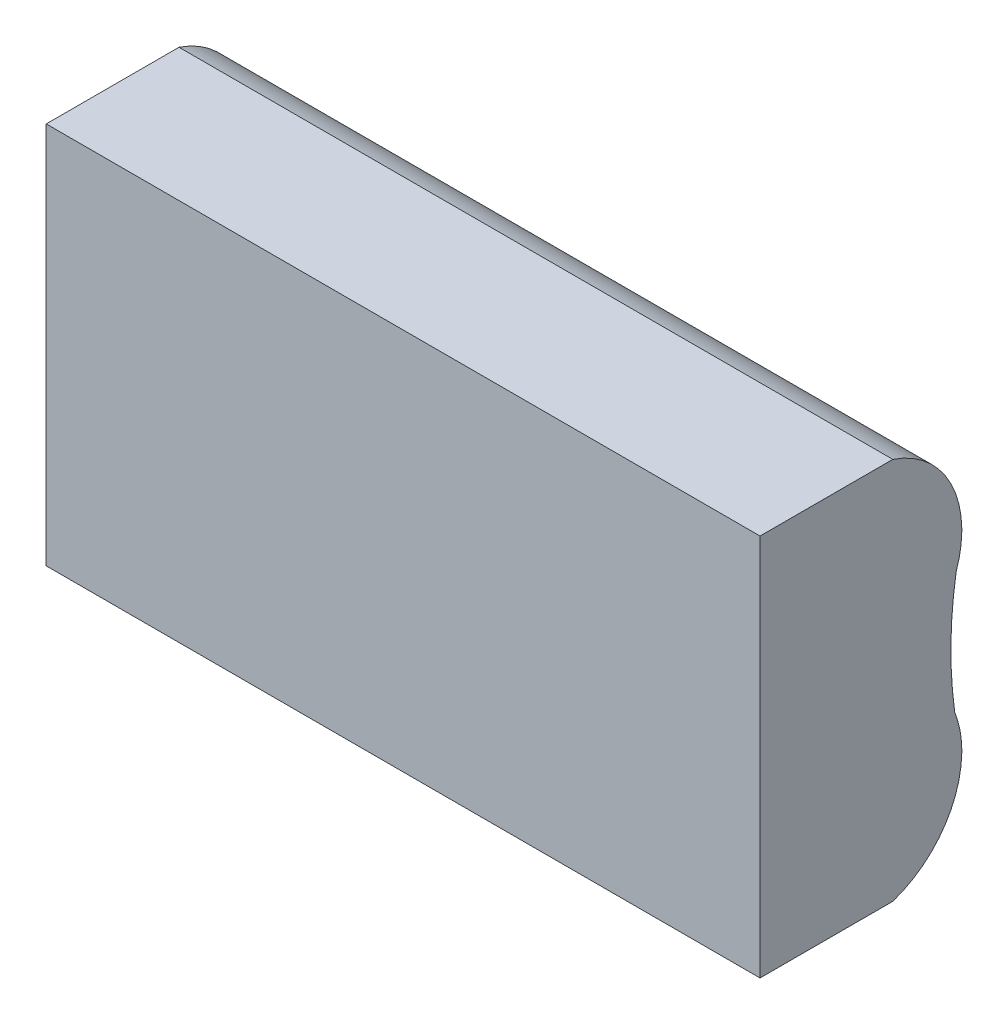
ISO-10303-21;
HEADER;
FILE_DESCRIPTION(('STEP AP214'),'2;1');
FILE_NAME('part.step','',(''),(''),'','','');
FILE_SCHEMA(('AUTOMOTIVE_DESIGN { 1 0 10303 214 1 1 1 1 }'));
ENDSEC;
DATA;
#1=APPLICATION_CONTEXT('core data for automotive mechanical design processes');
#2=APPLICATION_PROTOCOL_DEFINITION('international standard','automotive_design',2000,#1);
#3=PRODUCT_CONTEXT('',#1,'mechanical');
#4=PRODUCT('Part','Part','',(#3));
#5=PRODUCT_RELATED_PRODUCT_CATEGORY('part','',(#4));
#6=PRODUCT_DEFINITION_FORMATION('','',#4);
#7=PRODUCT_DEFINITION_CONTEXT('part definition',#1,'design');
#8=PRODUCT_DEFINITION('design','',#6,#7);
#9=PRODUCT_DEFINITION_SHAPE('','',#8);
#10=(LENGTH_UNIT() NAMED_UNIT(*) SI_UNIT(.MILLI.,.METRE.));
#11=(NAMED_UNIT(*) PLANE_ANGLE_UNIT() SI_UNIT($,.RADIAN.));
#12=(NAMED_UNIT(*) SI_UNIT($,.STERADIAN.) SOLID_ANGLE_UNIT());
#13=UNCERTAINTY_MEASURE_WITH_UNIT(LENGTH_MEASURE(1.E-05),#10,'distance_accuracy_value','');
#14=(GEOMETRIC_REPRESENTATION_CONTEXT(3) GLOBAL_UNCERTAINTY_ASSIGNED_CONTEXT((#13)) GLOBAL_UNIT_ASSIGNED_CONTEXT((#10,
#11,#12)) REPRESENTATION_CONTEXT('',''));
#15=CARTESIAN_POINT('',(0.,0.,0.));
#16=DIRECTION('',(0.,0.,1.));
#17=DIRECTION('',(1.,0.,0.));
#18=AXIS2_PLACEMENT_3D('',#15,#16,#17);
#19=CARTESIAN_POINT('',(34.5,18.5,19.5));
#20=DIRECTION('',(-1.,0.,0.));
#21=DIRECTION('',(0.,0.,1.));
#22=AXIS2_PLACEMENT_3D('',#19,#20,#21);
#23=PLANE('',#22);
#24=CARTESIAN_POINT('',(34.5,9.24999978624751,9.74801142738037));
#25=DIRECTION('',(1.,0.,0.));
#26=DIRECTION('',(0.,0.,-1.));
#27=AXIS2_PLACEMENT_3D('',#24,#25,#26);
#28=CIRCLE('',#27,9.75);
#29=CARTESIAN_POINT('',(34.5,9.44690893195086,0.));
#30=VERTEX_POINT('',#29);
#31=CARTESIAN_POINT('',(34.5,18.5,6.66580506738776));
#32=VERTEX_POINT('',#31);
#33=EDGE_CURVE('E56',#30,#32,#28,.T.);
#34=ORIENTED_EDGE('',*,*,#33,.T.);
#35=DIRECTION('',(0.,0.,-1.));
#36=VECTOR('',#35,1.);
#37=CARTESIAN_POINT('',(34.5,18.5,19.5));
#38=LINE('',#37,#36);
#39=CARTESIAN_POINT('',(34.5,18.5,19.5));
#40=VERTEX_POINT('',#39);
#41=EDGE_CURVE('E121',#40,#32,#38,.T.);
#42=ORIENTED_EDGE('',*,*,#41,.F.);
#43=DIRECTION('',(0.,1.,0.));
#44=VECTOR('',#43,1.);
#45=CARTESIAN_POINT('',(34.5,18.5,19.5));
#46=LINE('',#45,#44);
#47=CARTESIAN_POINT('',(34.5,-18.5,19.5));
#48=VERTEX_POINT('',#47);
#49=EDGE_CURVE('E153',#48,#40,#46,.T.);
#50=ORIENTED_EDGE('',*,*,#49,.F.);
#51=DIRECTION('',(0.,0.,-1.));
#52=VECTOR('',#51,1.);
#53=CARTESIAN_POINT('',(34.5,-18.5,19.5));
#54=LINE('',#53,#52);
#55=CARTESIAN_POINT('',(34.5,-18.5,6.66580378440416));
#56=VERTEX_POINT('',#55);
#57=EDGE_CURVE('E162',#48,#56,#54,.T.);
#58=ORIENTED_EDGE('',*,*,#57,.T.);
#59=CARTESIAN_POINT('',(34.5,-9.25000021375249,9.74801142738038));
#60=DIRECTION('',(1.,0.,0.));
#61=DIRECTION('',(0.,0.,-1.));
#62=AXIS2_PLACEMENT_3D('',#59,#60,#61);
#63=CIRCLE('',#62,9.75);
#64=CARTESIAN_POINT('',(34.5,-9.44690935945574,0.));
#65=VERTEX_POINT('',#64);
#66=EDGE_CURVE('E188',#56,#65,#63,.T.);
#67=ORIENTED_EDGE('',*,*,#66,.T.);
#68=DIRECTION('',(0.,1.,0.));
#69=VECTOR('',#68,1.);
#70=CARTESIAN_POINT('',(34.5,18.5,0.));
#71=LINE('',#70,#69);
#72=CARTESIAN_POINT('',(34.5,-9.05309106804925,0.));
#73=VERTEX_POINT('',#72);
#74=EDGE_CURVE('E158',#65,#73,#71,.T.);
#75=ORIENTED_EDGE('',*,*,#74,.T.);
#76=CARTESIAN_POINT('',(34.5,-9.25000021375249,9.74801142738038));
#77=DIRECTION('',(1.,0.,0.));
#78=DIRECTION('',(0.,0.,-1.));
#79=AXIS2_PLACEMENT_3D('',#76,#77,#78);
#80=CIRCLE('',#79,9.75);
#81=CARTESIAN_POINT('',(34.5,-5.67304861226276,0.677845098111656));
#82=VERTEX_POINT('',#81);
#83=EDGE_CURVE('E197',#73,#82,#80,.T.);
#84=ORIENTED_EDGE('',*,*,#83,.T.);
#85=CARTESIAN_POINT('',(34.5,-0.276529633140987,-37.9599616392635));
#86=DIRECTION('',(1.,0.,0.));
#87=DIRECTION('',(0.,0.,-1.));
#88=AXIS2_PLACEMENT_3D('',#85,#86,#87);
#89=CIRCLE('',#88,39.0128507874876);
#90=CARTESIAN_POINT('',(34.5,6.05875986244565,0.535059254014168));
#91=VERTEX_POINT('',#90);
#92=EDGE_CURVE('E210',#91,#82,#89,.T.);
#93=ORIENTED_EDGE('',*,*,#92,.F.);
#94=CARTESIAN_POINT('',(34.5,9.24999978624751,9.74801142738037));
#95=DIRECTION('',(1.,0.,0.));
#96=DIRECTION('',(0.,0.,-1.));
#97=AXIS2_PLACEMENT_3D('',#94,#95,#96);
#98=CIRCLE('',#97,9.75);
#99=CARTESIAN_POINT('',(34.5,9.05309064054415,0.));
#100=VERTEX_POINT('',#99);
#101=EDGE_CURVE('E206',#91,#100,#98,.T.);
#102=ORIENTED_EDGE('',*,*,#101,.T.);
#103=EDGE_CURVE('E124',#100,#30,#71,.T.);
#104=ORIENTED_EDGE('',*,*,#103,.T.);
#105=EDGE_LOOP('',(#34,#42,#50,#58,#67,#75,#84,#93,#102,#104));
#106=FACE_BOUND('',#105,.T.);
#107=ADVANCED_FACE('F34',(#106),#23,.F.);
#108=CARTESIAN_POINT('',(-34.5,18.5,19.5));
#109=DIRECTION('',(0.,-1.,0.));
#110=DIRECTION('',(0.,0.,-1.));
#111=AXIS2_PLACEMENT_3D('',#108,#109,#110);
#112=PLANE('',#111);
#113=DIRECTION('',(1.,0.,0.));
#114=VECTOR('',#113,1.);
#115=CARTESIAN_POINT('',(-35.5,18.5,6.66580506738776));
#116=LINE('',#115,#114);
#117=CARTESIAN_POINT('',(-34.5,18.5,6.66580506738776));
#118=VERTEX_POINT('',#117);
#119=EDGE_CURVE('E108',#118,#32,#116,.T.);
#120=ORIENTED_EDGE('',*,*,#119,.F.);
#121=DIRECTION('',(0.,0.,-1.));
#122=VECTOR('',#121,1.);
#123=CARTESIAN_POINT('',(-34.5,18.5,19.5));
#124=LINE('',#123,#122);
#125=CARTESIAN_POINT('',(-34.5,18.5,19.5));
#126=VERTEX_POINT('',#125);
#127=EDGE_CURVE('E131',#126,#118,#124,.T.);
#128=ORIENTED_EDGE('',*,*,#127,.F.);
#129=DIRECTION('',(-1.,0.,0.));
#130=VECTOR('',#129,1.);
#131=CARTESIAN_POINT('',(-34.5,18.5,19.5));
#132=LINE('',#131,#130);
#133=EDGE_CURVE('E128',#40,#126,#132,.T.);
#134=ORIENTED_EDGE('',*,*,#133,.F.);
#135=ORIENTED_EDGE('',*,*,#41,.T.);
#136=EDGE_LOOP('',(#120,#128,#134,#135));
#137=FACE_BOUND('',#136,.T.);
#138=ADVANCED_FACE('F127',(#137),#112,.F.);
#139=CARTESIAN_POINT('',(-34.5,18.5,19.5));
#140=DIRECTION('',(1.,0.,0.));
#141=DIRECTION('',(0.,1.,0.));
#142=AXIS2_PLACEMENT_3D('',#139,#140,#141);
#143=PLANE('',#142);
#144=CARTESIAN_POINT('',(-34.5,9.24999978624751,9.74801142738037));
#145=DIRECTION('',(1.,0.,0.));
#146=DIRECTION('',(0.,1.,0.));
#147=AXIS2_PLACEMENT_3D('',#144,#145,#146);
#148=CIRCLE('',#147,9.75);
#149=CARTESIAN_POINT('',(-34.5,9.44690893195086,0.));
#150=VERTEX_POINT('',#149);
#151=EDGE_CURVE('E111',#150,#118,#148,.T.);
#152=ORIENTED_EDGE('',*,*,#151,.F.);
#153=DIRECTION('',(0.,-1.,0.));
#154=VECTOR('',#153,1.);
#155=CARTESIAN_POINT('',(-34.5,18.5,0.));
#156=LINE('',#155,#154);
#157=CARTESIAN_POINT('',(-34.5,9.05309064054415,0.));
#158=VERTEX_POINT('',#157);
#159=EDGE_CURVE('E147',#150,#158,#156,.T.);
#160=ORIENTED_EDGE('',*,*,#159,.T.);
#161=CARTESIAN_POINT('',(-34.5,9.24999978624751,9.74801142738037));
#162=DIRECTION('',(1.,0.,0.));
#163=DIRECTION('',(0.,1.,0.));
#164=AXIS2_PLACEMENT_3D('',#161,#162,#163);
#165=CIRCLE('',#164,9.75);
#166=CARTESIAN_POINT('',(-34.5,6.05875986244565,0.535059254014168));
#167=VERTEX_POINT('',#166);
#168=EDGE_CURVE('E149',#167,#158,#165,.T.);
#169=ORIENTED_EDGE('',*,*,#168,.F.);
#170=CARTESIAN_POINT('',(-34.5,-0.276529633140987,-37.9599616392635));
#171=DIRECTION('',(1.,0.,0.));
#172=DIRECTION('',(0.,1.,0.));
#173=AXIS2_PLACEMENT_3D('',#170,#171,#172);
#174=CIRCLE('',#173,39.0128507874876);
#175=CARTESIAN_POINT('',(-34.5,-5.67304861226276,0.677845098111656));
#176=VERTEX_POINT('',#175);
#177=EDGE_CURVE('E11',#167,#176,#174,.T.);
#178=ORIENTED_EDGE('',*,*,#177,.T.);
#179=CARTESIAN_POINT('',(-34.5,-9.25000021375249,9.74801142738038));
#180=DIRECTION('',(1.,0.,0.));
#181=DIRECTION('',(0.,1.,0.));
#182=AXIS2_PLACEMENT_3D('',#179,#180,#181);
#183=CIRCLE('',#182,9.75);
#184=CARTESIAN_POINT('',(-34.5,-9.05309106804924,0.));
#185=VERTEX_POINT('',#184);
#186=EDGE_CURVE('E176',#185,#176,#183,.T.);
#187=ORIENTED_EDGE('',*,*,#186,.F.);
#188=CARTESIAN_POINT('',(-34.5,-9.44690935945574,0.));
#189=VERTEX_POINT('',#188);
#190=EDGE_CURVE('E154',#185,#189,#156,.T.);
#191=ORIENTED_EDGE('',*,*,#190,.T.);
#192=CARTESIAN_POINT('',(-34.5,-9.25000021375249,9.74801142738038));
#193=DIRECTION('',(1.,0.,0.));
#194=DIRECTION('',(0.,1.,0.));
#195=AXIS2_PLACEMENT_3D('',#192,#193,#194);
#196=CIRCLE('',#195,9.75);
#197=CARTESIAN_POINT('',(-34.5,-18.5,6.66580378440416));
#198=VERTEX_POINT('',#197);
#199=EDGE_CURVE('E48',#198,#189,#196,.T.);
#200=ORIENTED_EDGE('',*,*,#199,.F.);
#201=DIRECTION('',(0.,0.,-1.));
#202=VECTOR('',#201,1.);
#203=CARTESIAN_POINT('',(-34.5,-18.5,19.5));
#204=LINE('',#203,#202);
#205=CARTESIAN_POINT('',(-34.5,-18.5,19.5));
#206=VERTEX_POINT('',#205);
#207=EDGE_CURVE('E135',#206,#198,#204,.T.);
#208=ORIENTED_EDGE('',*,*,#207,.F.);
#209=DIRECTION('',(0.,-1.,0.));
#210=VECTOR('',#209,1.);
#211=CARTESIAN_POINT('',(-34.5,18.5,19.5));
#212=LINE('',#211,#210);
#213=EDGE_CURVE('E173',#126,#206,#212,.T.);
#214=ORIENTED_EDGE('',*,*,#213,.F.);
#215=ORIENTED_EDGE('',*,*,#127,.T.);
#216=EDGE_LOOP('',(#152,#160,#169,#178,#187,#191,#200,#208,#214,#215));
#217=FACE_BOUND('',#216,.T.);
#218=ADVANCED_FACE('F145',(#217),#143,.F.);
#219=CARTESIAN_POINT('',(-34.5,-18.5,19.5));
#220=DIRECTION('',(0.,1.,0.));
#221=DIRECTION('',(0.,0.,1.));
#222=AXIS2_PLACEMENT_3D('',#219,#220,#221);
#223=PLANE('',#222);
#224=DIRECTION('',(1.,0.,0.));
#225=VECTOR('',#224,1.);
#226=CARTESIAN_POINT('',(-35.5,-18.5,6.66580378440416));
#227=LINE('',#226,#225);
#228=EDGE_CURVE('E172',#198,#56,#227,.T.);
#229=ORIENTED_EDGE('',*,*,#228,.T.);
#230=ORIENTED_EDGE('',*,*,#57,.F.);
#231=DIRECTION('',(1.,0.,0.));
#232=VECTOR('',#231,1.);
#233=CARTESIAN_POINT('',(-34.5,-18.5,19.5));
#234=LINE('',#233,#232);
#235=EDGE_CURVE('E164',#206,#48,#234,.T.);
#236=ORIENTED_EDGE('',*,*,#235,.F.);
#237=ORIENTED_EDGE('',*,*,#207,.T.);
#238=EDGE_LOOP('',(#229,#230,#236,#237));
#239=FACE_BOUND('',#238,.T.);
#240=ADVANCED_FACE('F170',(#239),#223,.F.);
#241=CARTESIAN_POINT('',(0.,0.,0.));
#242=DIRECTION('',(0.,0.,1.));
#243=DIRECTION('',(1.,0.,0.));
#244=AXIS2_PLACEMENT_3D('',#241,#242,#243);
#245=PLANE('',#244);
#246=DIRECTION('',(1.,0.,0.));
#247=VECTOR('',#246,1.);
#248=CARTESIAN_POINT('',(-35.5,9.44690893195086,0.));
#249=LINE('',#248,#247);
#250=EDGE_CURVE('E41',#30,#150,#249,.F.);
#251=ORIENTED_EDGE('',*,*,#250,.F.);
#252=ORIENTED_EDGE('',*,*,#103,.F.);
#253=DIRECTION('',(1.,0.,0.));
#254=VECTOR('',#253,1.);
#255=CARTESIAN_POINT('',(-35.5,9.05309064054415,0.));
#256=LINE('',#255,#254);
#257=EDGE_CURVE('E140',#158,#100,#256,.T.);
#258=ORIENTED_EDGE('',*,*,#257,.F.);
#259=ORIENTED_EDGE('',*,*,#159,.F.);
#260=EDGE_LOOP('',(#251,#252,#258,#259));
#261=FACE_BOUND('',#260,.T.);
#262=ADVANCED_FACE('F152',(#261),#245,.F.);
#263=DIRECTION('',(1.,0.,0.));
#264=VECTOR('',#263,1.);
#265=CARTESIAN_POINT('',(-35.5,-9.05309106804924,0.));
#266=LINE('',#265,#264);
#267=EDGE_CURVE('E133',#73,#185,#266,.F.);
#268=ORIENTED_EDGE('',*,*,#267,.F.);
#269=ORIENTED_EDGE('',*,*,#74,.F.);
#270=DIRECTION('',(1.,0.,0.));
#271=VECTOR('',#270,1.);
#272=CARTESIAN_POINT('',(-35.5,-9.44690935945574,0.));
#273=LINE('',#272,#271);
#274=EDGE_CURVE('E130',#189,#65,#273,.T.);
#275=ORIENTED_EDGE('',*,*,#274,.F.);
#276=ORIENTED_EDGE('',*,*,#190,.F.);
#277=EDGE_LOOP('',(#268,#269,#275,#276));
#278=FACE_BOUND('',#277,.T.);
#279=ADVANCED_FACE('F193',(#278),#245,.F.);
#280=CARTESIAN_POINT('',(0.,0.,19.5));
#281=DIRECTION('',(0.,0.,1.));
#282=DIRECTION('',(1.,0.,0.));
#283=AXIS2_PLACEMENT_3D('',#280,#281,#282);
#284=PLANE('',#283);
#285=ORIENTED_EDGE('',*,*,#49,.T.);
#286=ORIENTED_EDGE('',*,*,#133,.T.);
#287=ORIENTED_EDGE('',*,*,#213,.T.);
#288=ORIENTED_EDGE('',*,*,#235,.T.);
#289=EDGE_LOOP('',(#285,#286,#287,#288));
#290=FACE_BOUND('',#289,.T.);
#291=ADVANCED_FACE('F185',(#290),#284,.T.);
#292=CARTESIAN_POINT('',(-35.5,-9.25000021375249,9.74801142738038));
#293=DIRECTION('',(1.,0.,0.));
#294=DIRECTION('',(0.,0.,-1.));
#295=AXIS2_PLACEMENT_3D('',#292,#293,#294);
#296=CYLINDRICAL_SURFACE('',#295,9.75);
#297=ORIENTED_EDGE('',*,*,#199,.T.);
#298=ORIENTED_EDGE('',*,*,#274,.T.);
#299=ORIENTED_EDGE('',*,*,#66,.F.);
#300=ORIENTED_EDGE('',*,*,#228,.F.);
#301=EDGE_LOOP('',(#297,#298,#299,#300));
#302=FACE_BOUND('',#301,.T.);
#303=ADVANCED_FACE('F221',(#302),#296,.T.);
#304=CARTESIAN_POINT('',(-35.5,-0.276529633140987,-37.9599616392635));
#305=DIRECTION('',(1.,0.,0.));
#306=DIRECTION('',(0.,0.,-1.));
#307=AXIS2_PLACEMENT_3D('',#304,#305,#306);
#308=CYLINDRICAL_SURFACE('',#307,39.0128507874876);
#309=DIRECTION('',(1.,0.,0.));
#310=VECTOR('',#309,1.);
#311=CARTESIAN_POINT('',(-35.5,6.05875986244565,0.535059254014168));
#312=LINE('',#311,#310);
#313=EDGE_CURVE('E202',#167,#91,#312,.T.);
#314=ORIENTED_EDGE('',*,*,#313,.T.);
#315=ORIENTED_EDGE('',*,*,#92,.T.);
#316=DIRECTION('',(1.,0.,0.));
#317=VECTOR('',#316,1.);
#318=CARTESIAN_POINT('',(-35.5,-5.67304861226276,0.677845098111656));
#319=LINE('',#318,#317);
#320=EDGE_CURVE('E125',#176,#82,#319,.T.);
#321=ORIENTED_EDGE('',*,*,#320,.F.);
#322=ORIENTED_EDGE('',*,*,#177,.F.);
#323=EDGE_LOOP('',(#314,#315,#321,#322));
#324=FACE_BOUND('',#323,.T.);
#325=ADVANCED_FACE('F200',(#324),#308,.F.);
#326=CARTESIAN_POINT('',(-35.5,9.24999978624751,9.74801142738037));
#327=DIRECTION('',(1.,0.,0.));
#328=DIRECTION('',(0.,0.,-1.));
#329=AXIS2_PLACEMENT_3D('',#326,#327,#328);
#330=CYLINDRICAL_SURFACE('',#329,9.75);
#331=ORIENTED_EDGE('',*,*,#168,.T.);
#332=ORIENTED_EDGE('',*,*,#257,.T.);
#333=ORIENTED_EDGE('',*,*,#101,.F.);
#334=ORIENTED_EDGE('',*,*,#313,.F.);
#335=EDGE_LOOP('',(#331,#332,#333,#334));
#336=FACE_BOUND('',#335,.T.);
#337=ADVANCED_FACE('F205',(#336),#330,.T.);
#338=CARTESIAN_POINT('',(-35.5,-9.25000021375249,9.74801142738038));
#339=DIRECTION('',(1.,0.,0.));
#340=DIRECTION('',(0.,0.,-1.));
#341=AXIS2_PLACEMENT_3D('',#338,#339,#340);
#342=CYLINDRICAL_SURFACE('',#341,9.75);
#343=ORIENTED_EDGE('',*,*,#186,.T.);
#344=ORIENTED_EDGE('',*,*,#320,.T.);
#345=ORIENTED_EDGE('',*,*,#83,.F.);
#346=ORIENTED_EDGE('',*,*,#267,.T.);
#347=EDGE_LOOP('',(#343,#344,#345,#346));
#348=FACE_BOUND('',#347,.T.);
#349=ADVANCED_FACE('F195',(#348),#342,.T.);
#350=CARTESIAN_POINT('',(-35.5,9.24999978624751,9.74801142738037));
#351=DIRECTION('',(1.,0.,0.));
#352=DIRECTION('',(0.,0.,-1.));
#353=AXIS2_PLACEMENT_3D('',#350,#351,#352);
#354=CYLINDRICAL_SURFACE('',#353,9.75);
#355=ORIENTED_EDGE('',*,*,#151,.T.);
#356=ORIENTED_EDGE('',*,*,#119,.T.);
#357=ORIENTED_EDGE('',*,*,#33,.F.);
#358=ORIENTED_EDGE('',*,*,#250,.T.);
#359=EDGE_LOOP('',(#355,#356,#357,#358));
#360=FACE_BOUND('',#359,.T.);
#361=ADVANCED_FACE('F109',(#360),#354,.T.);
#362=CLOSED_SHELL('',(#107,#138,#218,#240,#262,#279,#291,#303,#325,#337,#349,#361));
#363=MANIFOLD_SOLID_BREP('B2',#362);
#364=ADVANCED_BREP_SHAPE_REPRESENTATION('',(#18,#363),#14);
#365=SHAPE_DEFINITION_REPRESENTATION(#9,#364);
ENDSEC;
END-ISO-10303-21;
